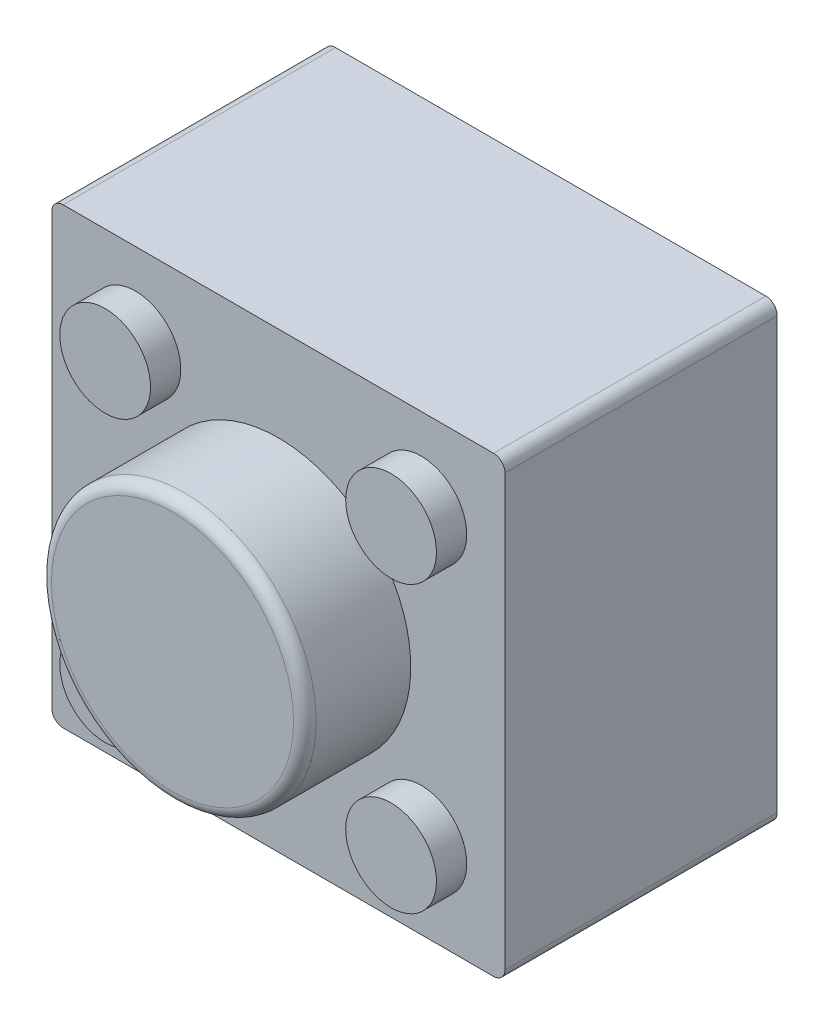
ISO-10303-21;
HEADER;
FILE_DESCRIPTION(('STEP AP214'),'2;1');
FILE_NAME('part.step','',(''),(''),'','','');
FILE_SCHEMA(('AUTOMOTIVE_DESIGN { 1 0 10303 214 1 1 1 1 }'));
ENDSEC;
DATA;
#1=APPLICATION_CONTEXT('core data for automotive mechanical design processes');
#2=APPLICATION_PROTOCOL_DEFINITION('international standard','automotive_design',2000,#1);
#3=PRODUCT_CONTEXT('',#1,'mechanical');
#4=PRODUCT('Part','Part','',(#3));
#5=PRODUCT_RELATED_PRODUCT_CATEGORY('part','',(#4));
#6=PRODUCT_DEFINITION_FORMATION('','',#4);
#7=PRODUCT_DEFINITION_CONTEXT('part definition',#1,'design');
#8=PRODUCT_DEFINITION('design','',#6,#7);
#9=PRODUCT_DEFINITION_SHAPE('','',#8);
#10=(LENGTH_UNIT() NAMED_UNIT(*) SI_UNIT(.MILLI.,.METRE.));
#11=(NAMED_UNIT(*) PLANE_ANGLE_UNIT() SI_UNIT($,.RADIAN.));
#12=(NAMED_UNIT(*) SI_UNIT($,.STERADIAN.) SOLID_ANGLE_UNIT());
#13=UNCERTAINTY_MEASURE_WITH_UNIT(LENGTH_MEASURE(1.E-05),#10,'distance_accuracy_value','');
#14=(GEOMETRIC_REPRESENTATION_CONTEXT(3) GLOBAL_UNCERTAINTY_ASSIGNED_CONTEXT((#13)) GLOBAL_UNIT_ASSIGNED_CONTEXT((#10,
#11,#12)) REPRESENTATION_CONTEXT('',''));
#15=CARTESIAN_POINT('',(0.,0.,0.));
#16=DIRECTION('',(0.,0.,1.));
#17=DIRECTION('',(1.,0.,0.));
#18=AXIS2_PLACEMENT_3D('',#15,#16,#17);
#19=CARTESIAN_POINT('',(0.,0.,3.6));
#20=DIRECTION('',(0.,0.,-1.));
#21=DIRECTION('',(-1.,0.,0.));
#22=AXIS2_PLACEMENT_3D('',#19,#20,#21);
#23=PLANE('',#22);
#24=DIRECTION('',(0.,-1.,0.));
#25=VECTOR('',#24,1.);
#26=CARTESIAN_POINT('',(0.,0.,3.6));
#27=LINE('',#26,#25);
#28=CARTESIAN_POINT('',(0.,5.84,3.6));
#29=VERTEX_POINT('',#28);
#30=CARTESIAN_POINT('',(0.,0.15,3.6));
#31=VERTEX_POINT('',#30);
#32=EDGE_CURVE('E139',#29,#31,#27,.T.);
#33=ORIENTED_EDGE('',*,*,#32,.T.);
#34=CARTESIAN_POINT('',(0.15,0.15,3.6));
#35=DIRECTION('',(0.,0.,-1.));
#36=DIRECTION('',(-1.,0.,0.));
#37=AXIS2_PLACEMENT_3D('',#34,#35,#36);
#38=CIRCLE('',#37,0.15);
#39=CARTESIAN_POINT('',(0.15,0.,3.6));
#40=VERTEX_POINT('',#39);
#41=EDGE_CURVE('E163',#31,#40,#38,.F.);
#42=ORIENTED_EDGE('',*,*,#41,.T.);
#43=DIRECTION('',(1.,0.,0.));
#44=VECTOR('',#43,1.);
#45=CARTESIAN_POINT('',(0.,0.,3.6));
#46=LINE('',#45,#44);
#47=CARTESIAN_POINT('',(5.84,0.,3.6));
#48=VERTEX_POINT('',#47);
#49=EDGE_CURVE('E122',#40,#48,#46,.T.);
#50=ORIENTED_EDGE('',*,*,#49,.T.);
#51=CARTESIAN_POINT('',(5.84,0.15,3.6));
#52=DIRECTION('',(0.,0.,-1.));
#53=DIRECTION('',(-1.,0.,0.));
#54=AXIS2_PLACEMENT_3D('',#51,#52,#53);
#55=CIRCLE('',#54,0.15);
#56=CARTESIAN_POINT('',(5.99,0.15,3.6));
#57=VERTEX_POINT('',#56);
#58=EDGE_CURVE('E158',#48,#57,#55,.F.);
#59=ORIENTED_EDGE('',*,*,#58,.T.);
#60=DIRECTION('',(0.,1.,0.));
#61=VECTOR('',#60,1.);
#62=CARTESIAN_POINT('',(5.99,0.,3.6));
#63=LINE('',#62,#61);
#64=CARTESIAN_POINT('',(5.99,5.84,3.6));
#65=VERTEX_POINT('',#64);
#66=EDGE_CURVE('E271',#57,#65,#63,.T.);
#67=ORIENTED_EDGE('',*,*,#66,.T.);
#68=CARTESIAN_POINT('',(5.84,5.84,3.6));
#69=DIRECTION('',(0.,0.,-1.));
#70=DIRECTION('',(-1.,0.,0.));
#71=AXIS2_PLACEMENT_3D('',#68,#69,#70);
#72=CIRCLE('',#71,0.15);
#73=CARTESIAN_POINT('',(5.84,5.99,3.6));
#74=VERTEX_POINT('',#73);
#75=EDGE_CURVE('E57',#65,#74,#72,.F.);
#76=ORIENTED_EDGE('',*,*,#75,.T.);
#77=DIRECTION('',(-1.,0.,0.));
#78=VECTOR('',#77,1.);
#79=CARTESIAN_POINT('',(0.,5.99,3.6));
#80=LINE('',#79,#78);
#81=CARTESIAN_POINT('',(0.15,5.99,3.6));
#82=VERTEX_POINT('',#81);
#83=EDGE_CURVE('E144',#74,#82,#80,.T.);
#84=ORIENTED_EDGE('',*,*,#83,.T.);
#85=CARTESIAN_POINT('',(0.15,5.84,3.6));
#86=DIRECTION('',(0.,0.,-1.));
#87=DIRECTION('',(-1.,0.,0.));
#88=AXIS2_PLACEMENT_3D('',#85,#86,#87);
#89=CIRCLE('',#88,0.15);
#90=EDGE_CURVE('E161',#82,#29,#89,.F.);
#91=ORIENTED_EDGE('',*,*,#90,.T.);
#92=EDGE_LOOP('',(#33,#42,#50,#59,#67,#76,#84,#91));
#93=FACE_BOUND('',#92,.T.);
#94=CARTESIAN_POINT('',(2.995,2.995,3.6));
#95=DIRECTION('',(0.,0.,-1.));
#96=DIRECTION('',(-1.,0.,0.));
#97=AXIS2_PLACEMENT_3D('',#94,#95,#96);
#98=CIRCLE('',#97,1.75);
#99=CARTESIAN_POINT('',(1.245,2.995,3.6));
#100=VERTEX_POINT('',#99);
#101=EDGE_CURVE('E140',#100,#100,#98,.F.);
#102=ORIENTED_EDGE('',*,*,#101,.F.);
#103=EDGE_LOOP('',(#102));
#104=FACE_BOUND('',#103,.T.);
#105=CARTESIAN_POINT('',(1.105,4.88,3.6));
#106=DIRECTION('',(0.,0.,-1.));
#107=DIRECTION('',(-1.,0.,0.));
#108=AXIS2_PLACEMENT_3D('',#105,#106,#107);
#109=CIRCLE('',#108,0.6);
#110=CARTESIAN_POINT('',(0.504999999999999,4.88,3.6));
#111=VERTEX_POINT('',#110);
#112=EDGE_CURVE('E174',#111,#111,#109,.F.);
#113=ORIENTED_EDGE('',*,*,#112,.F.);
#114=EDGE_LOOP('',(#113));
#115=FACE_BOUND('',#114,.T.);
#116=CARTESIAN_POINT('',(4.885,4.88,3.6));
#117=DIRECTION('',(0.,0.,-1.));
#118=DIRECTION('',(-1.,0.,0.));
#119=AXIS2_PLACEMENT_3D('',#116,#117,#118);
#120=CIRCLE('',#119,0.6);
#121=CARTESIAN_POINT('',(4.285,4.88,3.6));
#122=VERTEX_POINT('',#121);
#123=EDGE_CURVE('E177',#122,#122,#120,.F.);
#124=ORIENTED_EDGE('',*,*,#123,.F.);
#125=EDGE_LOOP('',(#124));
#126=FACE_BOUND('',#125,.T.);
#127=CARTESIAN_POINT('',(4.885,1.11,3.6));
#128=DIRECTION('',(0.,0.,-1.));
#129=DIRECTION('',(-1.,0.,0.));
#130=AXIS2_PLACEMENT_3D('',#127,#128,#129);
#131=CIRCLE('',#130,0.6);
#132=CARTESIAN_POINT('',(4.285,1.11,3.6));
#133=VERTEX_POINT('',#132);
#134=EDGE_CURVE('E43',#133,#133,#131,.F.);
#135=ORIENTED_EDGE('',*,*,#134,.F.);
#136=EDGE_LOOP('',(#135));
#137=FACE_BOUND('',#136,.T.);
#138=CARTESIAN_POINT('',(1.105,1.11,3.6));
#139=DIRECTION('',(0.,0.,-1.));
#140=DIRECTION('',(-1.,0.,0.));
#141=AXIS2_PLACEMENT_3D('',#138,#139,#140);
#142=CIRCLE('',#141,0.6);
#143=CARTESIAN_POINT('',(0.504999999999999,1.11,3.6));
#144=VERTEX_POINT('',#143);
#145=EDGE_CURVE('E11',#144,#144,#142,.F.);
#146=ORIENTED_EDGE('',*,*,#145,.F.);
#147=EDGE_LOOP('',(#146));
#148=FACE_BOUND('',#147,.T.);
#149=ADVANCED_FACE('F35',(#93,#104,#115,#126,#137,#148),#23,.F.);
#150=CARTESIAN_POINT('',(0.,0.,3.6));
#151=DIRECTION('',(1.,0.,0.));
#152=DIRECTION('',(0.,0.,-1.));
#153=AXIS2_PLACEMENT_3D('',#150,#151,#152);
#154=PLANE('',#153);
#155=DIRECTION('',(0.,-1.,0.));
#156=VECTOR('',#155,1.);
#157=CARTESIAN_POINT('',(0.,0.,0.));
#158=LINE('',#157,#156);
#159=CARTESIAN_POINT('',(0.,5.84,0.));
#160=VERTEX_POINT('',#159);
#161=CARTESIAN_POINT('',(0.,0.15,0.));
#162=VERTEX_POINT('',#161);
#163=EDGE_CURVE('E129',#160,#162,#158,.T.);
#164=ORIENTED_EDGE('',*,*,#163,.T.);
#165=DIRECTION('',(0.,0.,-1.));
#166=VECTOR('',#165,1.);
#167=CARTESIAN_POINT('',(0.,0.15,3.6));
#168=LINE('',#167,#166);
#169=EDGE_CURVE('E107',#162,#31,#168,.F.);
#170=ORIENTED_EDGE('',*,*,#169,.T.);
#171=ORIENTED_EDGE('',*,*,#32,.F.);
#172=DIRECTION('',(0.,0.,-1.));
#173=VECTOR('',#172,1.);
#174=CARTESIAN_POINT('',(0.,5.84,3.6));
#175=LINE('',#174,#173);
#176=EDGE_CURVE('E112',#29,#160,#175,.T.);
#177=ORIENTED_EDGE('',*,*,#176,.T.);
#178=EDGE_LOOP('',(#164,#170,#171,#177));
#179=FACE_BOUND('',#178,.T.);
#180=ADVANCED_FACE('F186',(#179),#154,.F.);
#181=CARTESIAN_POINT('',(0.,0.,3.6));
#182=DIRECTION('',(0.,1.,0.));
#183=DIRECTION('',(0.,0.,1.));
#184=AXIS2_PLACEMENT_3D('',#181,#182,#183);
#185=PLANE('',#184);
#186=ORIENTED_EDGE('',*,*,#49,.F.);
#187=DIRECTION('',(0.,0.,-1.));
#188=VECTOR('',#187,1.);
#189=CARTESIAN_POINT('',(0.15,0.,3.6));
#190=LINE('',#189,#188);
#191=CARTESIAN_POINT('',(0.15,0.,0.));
#192=VERTEX_POINT('',#191);
#193=EDGE_CURVE('E106',#40,#192,#190,.T.);
#194=ORIENTED_EDGE('',*,*,#193,.T.);
#195=DIRECTION('',(1.,0.,0.));
#196=VECTOR('',#195,1.);
#197=CARTESIAN_POINT('',(0.,0.,0.));
#198=LINE('',#197,#196);
#199=CARTESIAN_POINT('',(5.84,0.,0.));
#200=VERTEX_POINT('',#199);
#201=EDGE_CURVE('E119',#192,#200,#198,.T.);
#202=ORIENTED_EDGE('',*,*,#201,.T.);
#203=DIRECTION('',(0.,0.,-1.));
#204=VECTOR('',#203,1.);
#205=CARTESIAN_POINT('',(5.84,0.,3.6));
#206=LINE('',#205,#204);
#207=EDGE_CURVE('E124',#200,#48,#206,.F.);
#208=ORIENTED_EDGE('',*,*,#207,.T.);
#209=EDGE_LOOP('',(#186,#194,#202,#208));
#210=FACE_BOUND('',#209,.T.);
#211=ADVANCED_FACE('F118',(#210),#185,.F.);
#212=CARTESIAN_POINT('',(5.99,0.,3.6));
#213=DIRECTION('',(-1.,0.,0.));
#214=DIRECTION('',(0.,0.,1.));
#215=AXIS2_PLACEMENT_3D('',#212,#213,#214);
#216=PLANE('',#215);
#217=DIRECTION('',(0.,1.,0.));
#218=VECTOR('',#217,1.);
#219=CARTESIAN_POINT('',(5.99,0.,0.));
#220=LINE('',#219,#218);
#221=CARTESIAN_POINT('',(5.99,0.15,0.));
#222=VERTEX_POINT('',#221);
#223=CARTESIAN_POINT('',(5.99,5.84,0.));
#224=VERTEX_POINT('',#223);
#225=EDGE_CURVE('E128',#222,#224,#220,.T.);
#226=ORIENTED_EDGE('',*,*,#225,.T.);
#227=DIRECTION('',(0.,0.,-1.));
#228=VECTOR('',#227,1.);
#229=CARTESIAN_POINT('',(5.99,5.84,3.6));
#230=LINE('',#229,#228);
#231=EDGE_CURVE('E172',#224,#65,#230,.F.);
#232=ORIENTED_EDGE('',*,*,#231,.T.);
#233=ORIENTED_EDGE('',*,*,#66,.F.);
#234=DIRECTION('',(0.,0.,-1.));
#235=VECTOR('',#234,1.);
#236=CARTESIAN_POINT('',(5.99,0.15,3.6));
#237=LINE('',#236,#235);
#238=EDGE_CURVE('E169',#57,#222,#237,.T.);
#239=ORIENTED_EDGE('',*,*,#238,.T.);
#240=EDGE_LOOP('',(#226,#232,#233,#239));
#241=FACE_BOUND('',#240,.T.);
#242=ADVANCED_FACE('F239',(#241),#216,.F.);
#243=CARTESIAN_POINT('',(0.,5.99,3.6));
#244=DIRECTION('',(0.,-1.,0.));
#245=DIRECTION('',(0.,0.,-1.));
#246=AXIS2_PLACEMENT_3D('',#243,#244,#245);
#247=PLANE('',#246);
#248=DIRECTION('',(-1.,0.,0.));
#249=VECTOR('',#248,1.);
#250=CARTESIAN_POINT('',(0.,5.99,0.));
#251=LINE('',#250,#249);
#252=CARTESIAN_POINT('',(5.84,5.99,0.));
#253=VERTEX_POINT('',#252);
#254=CARTESIAN_POINT('',(0.15,5.99,0.));
#255=VERTEX_POINT('',#254);
#256=EDGE_CURVE('E132',#253,#255,#251,.T.);
#257=ORIENTED_EDGE('',*,*,#256,.T.);
#258=DIRECTION('',(0.,0.,-1.));
#259=VECTOR('',#258,1.);
#260=CARTESIAN_POINT('',(0.15,5.99,3.6));
#261=LINE('',#260,#259);
#262=EDGE_CURVE('E50',#255,#82,#261,.F.);
#263=ORIENTED_EDGE('',*,*,#262,.T.);
#264=ORIENTED_EDGE('',*,*,#83,.F.);
#265=DIRECTION('',(0.,0.,-1.));
#266=VECTOR('',#265,1.);
#267=CARTESIAN_POINT('',(5.84,5.99,3.6));
#268=LINE('',#267,#266);
#269=EDGE_CURVE('E165',#74,#253,#268,.T.);
#270=ORIENTED_EDGE('',*,*,#269,.T.);
#271=EDGE_LOOP('',(#257,#263,#264,#270));
#272=FACE_BOUND('',#271,.T.);
#273=ADVANCED_FACE('F236',(#272),#247,.F.);
#274=CARTESIAN_POINT('',(0.,0.,0.));
#275=DIRECTION('',(0.,0.,-1.));
#276=DIRECTION('',(-1.,0.,0.));
#277=AXIS2_PLACEMENT_3D('',#274,#275,#276);
#278=PLANE('',#277);
#279=ORIENTED_EDGE('',*,*,#201,.F.);
#280=CARTESIAN_POINT('',(0.15,0.15,0.));
#281=DIRECTION('',(0.,0.,-1.));
#282=DIRECTION('',(-1.,0.,0.));
#283=AXIS2_PLACEMENT_3D('',#280,#281,#282);
#284=CIRCLE('',#283,0.15);
#285=EDGE_CURVE('E102',#192,#162,#284,.T.);
#286=ORIENTED_EDGE('',*,*,#285,.T.);
#287=ORIENTED_EDGE('',*,*,#163,.F.);
#288=CARTESIAN_POINT('',(0.15,5.84,0.));
#289=DIRECTION('',(0.,0.,-1.));
#290=DIRECTION('',(-1.,0.,0.));
#291=AXIS2_PLACEMENT_3D('',#288,#289,#290);
#292=CIRCLE('',#291,0.15);
#293=EDGE_CURVE('E113',#160,#255,#292,.T.);
#294=ORIENTED_EDGE('',*,*,#293,.T.);
#295=ORIENTED_EDGE('',*,*,#256,.F.);
#296=CARTESIAN_POINT('',(5.84,5.84,0.));
#297=DIRECTION('',(0.,0.,-1.));
#298=DIRECTION('',(-1.,0.,0.));
#299=AXIS2_PLACEMENT_3D('',#296,#297,#298);
#300=CIRCLE('',#299,0.15);
#301=EDGE_CURVE('E152',#253,#224,#300,.T.);
#302=ORIENTED_EDGE('',*,*,#301,.T.);
#303=ORIENTED_EDGE('',*,*,#225,.F.);
#304=CARTESIAN_POINT('',(5.84,0.15,0.));
#305=DIRECTION('',(0.,0.,-1.));
#306=DIRECTION('',(-1.,0.,0.));
#307=AXIS2_PLACEMENT_3D('',#304,#305,#306);
#308=CIRCLE('',#307,0.15);
#309=EDGE_CURVE('E123',#222,#200,#308,.T.);
#310=ORIENTED_EDGE('',*,*,#309,.T.);
#311=EDGE_LOOP('',(#279,#286,#287,#294,#295,#302,#303,#310));
#312=FACE_BOUND('',#311,.T.);
#313=ADVANCED_FACE('F126',(#312),#278,.T.);
#314=CARTESIAN_POINT('',(2.995,2.995,5.));
#315=DIRECTION('',(0.,0.,-1.));
#316=DIRECTION('',(-1.,0.,0.));
#317=AXIS2_PLACEMENT_3D('',#314,#315,#316);
#318=CYLINDRICAL_SURFACE('',#317,1.75);
#319=CARTESIAN_POINT('',(2.995,2.995,4.85));
#320=DIRECTION('',(0.,0.,1.));
#321=DIRECTION('',(1.,0.,0.));
#322=AXIS2_PLACEMENT_3D('',#319,#320,#321);
#323=CIRCLE('',#322,1.75);
#324=CARTESIAN_POINT('',(4.745,2.995,4.85));
#325=VERTEX_POINT('',#324);
#326=EDGE_CURVE('E147',#325,#325,#323,.F.);
#327=ORIENTED_EDGE('',*,*,#326,.T.);
#328=EDGE_LOOP('',(#327));
#329=FACE_BOUND('',#328,.T.);
#330=ORIENTED_EDGE('',*,*,#101,.T.);
#331=EDGE_LOOP('',(#330));
#332=FACE_BOUND('',#331,.T.);
#333=ADVANCED_FACE('F229',(#329,#332),#318,.T.);
#334=CARTESIAN_POINT('',(2.995,2.995,5.));
#335=DIRECTION('',(0.,0.,1.));
#336=DIRECTION('',(1.,0.,0.));
#337=AXIS2_PLACEMENT_3D('',#334,#335,#336);
#338=PLANE('',#337);
#339=CARTESIAN_POINT('',(2.995,2.995,5.));
#340=DIRECTION('',(0.,0.,1.));
#341=DIRECTION('',(1.,0.,0.));
#342=AXIS2_PLACEMENT_3D('',#339,#340,#341);
#343=CIRCLE('',#342,1.6);
#344=CARTESIAN_POINT('',(4.595,2.995,5.));
#345=VERTEX_POINT('',#344);
#346=EDGE_CURVE('E143',#345,#345,#343,.T.);
#347=ORIENTED_EDGE('',*,*,#346,.T.);
#348=EDGE_LOOP('',(#347));
#349=FACE_BOUND('',#348,.T.);
#350=ADVANCED_FACE('F225',(#349),#338,.T.);
#351=CARTESIAN_POINT('',(2.995,2.995,4.85));
#352=DIRECTION('',(0.,0.,1.));
#353=DIRECTION('',(1.,0.,0.));
#354=AXIS2_PLACEMENT_3D('',#351,#352,#353);
#355=TOROIDAL_SURFACE('',#354,1.6,0.15);
#356=ORIENTED_EDGE('',*,*,#326,.F.);
#357=EDGE_LOOP('',(#356));
#358=FACE_BOUND('',#357,.T.);
#359=ORIENTED_EDGE('',*,*,#346,.F.);
#360=EDGE_LOOP('',(#359));
#361=FACE_BOUND('',#360,.T.);
#362=ADVANCED_FACE('F228',(#358,#361),#355,.T.);
#363=CARTESIAN_POINT('',(0.15,0.15,3.6));
#364=DIRECTION('',(0.,0.,-1.));
#365=DIRECTION('',(-1.,0.,0.));
#366=AXIS2_PLACEMENT_3D('',#363,#364,#365);
#367=CYLINDRICAL_SURFACE('',#366,0.15);
#368=ORIENTED_EDGE('',*,*,#41,.F.);
#369=ORIENTED_EDGE('',*,*,#169,.F.);
#370=ORIENTED_EDGE('',*,*,#285,.F.);
#371=ORIENTED_EDGE('',*,*,#193,.F.);
#372=EDGE_LOOP('',(#368,#369,#370,#371));
#373=FACE_BOUND('',#372,.T.);
#374=ADVANCED_FACE('F105',(#373),#367,.T.);
#375=CARTESIAN_POINT('',(0.15,5.84,3.6));
#376=DIRECTION('',(0.,0.,-1.));
#377=DIRECTION('',(-1.,0.,0.));
#378=AXIS2_PLACEMENT_3D('',#375,#376,#377);
#379=CYLINDRICAL_SURFACE('',#378,0.15);
#380=ORIENTED_EDGE('',*,*,#90,.F.);
#381=ORIENTED_EDGE('',*,*,#262,.F.);
#382=ORIENTED_EDGE('',*,*,#293,.F.);
#383=ORIENTED_EDGE('',*,*,#176,.F.);
#384=EDGE_LOOP('',(#380,#381,#382,#383));
#385=FACE_BOUND('',#384,.T.);
#386=ADVANCED_FACE('F253',(#385),#379,.T.);
#387=CARTESIAN_POINT('',(5.84,5.84,3.6));
#388=DIRECTION('',(0.,0.,-1.));
#389=DIRECTION('',(-1.,0.,0.));
#390=AXIS2_PLACEMENT_3D('',#387,#388,#389);
#391=CYLINDRICAL_SURFACE('',#390,0.15);
#392=ORIENTED_EDGE('',*,*,#75,.F.);
#393=ORIENTED_EDGE('',*,*,#231,.F.);
#394=ORIENTED_EDGE('',*,*,#301,.F.);
#395=ORIENTED_EDGE('',*,*,#269,.F.);
#396=EDGE_LOOP('',(#392,#393,#394,#395));
#397=FACE_BOUND('',#396,.T.);
#398=ADVANCED_FACE('F255',(#397),#391,.T.);
#399=CARTESIAN_POINT('',(5.84,0.15,3.6));
#400=DIRECTION('',(0.,0.,-1.));
#401=DIRECTION('',(-1.,0.,0.));
#402=AXIS2_PLACEMENT_3D('',#399,#400,#401);
#403=CYLINDRICAL_SURFACE('',#402,0.15);
#404=ORIENTED_EDGE('',*,*,#58,.F.);
#405=ORIENTED_EDGE('',*,*,#207,.F.);
#406=ORIENTED_EDGE('',*,*,#309,.F.);
#407=ORIENTED_EDGE('',*,*,#238,.F.);
#408=EDGE_LOOP('',(#404,#405,#406,#407));
#409=FACE_BOUND('',#408,.T.);
#410=ADVANCED_FACE('F37',(#409),#403,.T.);
#411=CARTESIAN_POINT('',(1.105,4.88,4.));
#412=DIRECTION('',(0.,0.,-1.));
#413=DIRECTION('',(-1.,0.,0.));
#414=AXIS2_PLACEMENT_3D('',#411,#412,#413);
#415=CYLINDRICAL_SURFACE('',#414,0.6);
#416=CARTESIAN_POINT('',(1.105,4.88,4.));
#417=DIRECTION('',(0.,0.,1.));
#418=DIRECTION('',(1.,0.,0.));
#419=AXIS2_PLACEMENT_3D('',#416,#417,#418);
#420=CIRCLE('',#419,0.6);
#421=CARTESIAN_POINT('',(1.705,4.88,4.));
#422=VERTEX_POINT('',#421);
#423=EDGE_CURVE('E134',#422,#422,#420,.T.);
#424=ORIENTED_EDGE('',*,*,#423,.F.);
#425=EDGE_LOOP('',(#424));
#426=FACE_BOUND('',#425,.T.);
#427=ORIENTED_EDGE('',*,*,#112,.T.);
#428=EDGE_LOOP('',(#427));
#429=FACE_BOUND('',#428,.T.);
#430=ADVANCED_FACE('F220',(#426,#429),#415,.T.);
#431=CARTESIAN_POINT('',(1.105,4.88,4.));
#432=DIRECTION('',(0.,0.,1.));
#433=DIRECTION('',(1.,0.,0.));
#434=AXIS2_PLACEMENT_3D('',#431,#432,#433);
#435=PLANE('',#434);
#436=ORIENTED_EDGE('',*,*,#423,.T.);
#437=EDGE_LOOP('',(#436));
#438=FACE_BOUND('',#437,.T.);
#439=ADVANCED_FACE('F216',(#438),#435,.T.);
#440=CARTESIAN_POINT('',(4.885,4.88,4.));
#441=DIRECTION('',(0.,0.,-1.));
#442=DIRECTION('',(-1.,0.,0.));
#443=AXIS2_PLACEMENT_3D('',#440,#441,#442);
#444=CYLINDRICAL_SURFACE('',#443,0.6);
#445=CARTESIAN_POINT('',(4.885,4.88,4.));
#446=DIRECTION('',(0.,0.,1.));
#447=DIRECTION('',(1.,0.,0.));
#448=AXIS2_PLACEMENT_3D('',#445,#446,#447);
#449=CIRCLE('',#448,0.6);
#450=CARTESIAN_POINT('',(5.485,4.88,4.));
#451=VERTEX_POINT('',#450);
#452=EDGE_CURVE('E289',#451,#451,#449,.T.);
#453=ORIENTED_EDGE('',*,*,#452,.F.);
#454=EDGE_LOOP('',(#453));
#455=FACE_BOUND('',#454,.T.);
#456=ORIENTED_EDGE('',*,*,#123,.T.);
#457=EDGE_LOOP('',(#456));
#458=FACE_BOUND('',#457,.T.);
#459=ADVANCED_FACE('F212',(#455,#458),#444,.T.);
#460=CARTESIAN_POINT('',(4.885,4.88,4.));
#461=DIRECTION('',(0.,0.,1.));
#462=DIRECTION('',(1.,0.,0.));
#463=AXIS2_PLACEMENT_3D('',#460,#461,#462);
#464=PLANE('',#463);
#465=ORIENTED_EDGE('',*,*,#452,.T.);
#466=EDGE_LOOP('',(#465));
#467=FACE_BOUND('',#466,.T.);
#468=ADVANCED_FACE('F208',(#467),#464,.T.);
#469=CARTESIAN_POINT('',(4.885,1.11,4.));
#470=DIRECTION('',(0.,0.,-1.));
#471=DIRECTION('',(-1.,0.,0.));
#472=AXIS2_PLACEMENT_3D('',#469,#470,#471);
#473=CYLINDRICAL_SURFACE('',#472,0.6);
#474=CARTESIAN_POINT('',(4.885,1.11,4.));
#475=DIRECTION('',(0.,0.,1.));
#476=DIRECTION('',(1.,0.,0.));
#477=AXIS2_PLACEMENT_3D('',#474,#475,#476);
#478=CIRCLE('',#477,0.6);
#479=CARTESIAN_POINT('',(5.485,1.11,4.));
#480=VERTEX_POINT('',#479);
#481=EDGE_CURVE('E292',#480,#480,#478,.T.);
#482=ORIENTED_EDGE('',*,*,#481,.F.);
#483=EDGE_LOOP('',(#482));
#484=FACE_BOUND('',#483,.T.);
#485=ORIENTED_EDGE('',*,*,#134,.T.);
#486=EDGE_LOOP('',(#485));
#487=FACE_BOUND('',#486,.T.);
#488=ADVANCED_FACE('F182',(#484,#487),#473,.T.);
#489=CARTESIAN_POINT('',(4.885,1.11,4.));
#490=DIRECTION('',(0.,0.,1.));
#491=DIRECTION('',(1.,0.,0.));
#492=AXIS2_PLACEMENT_3D('',#489,#490,#491);
#493=PLANE('',#492);
#494=ORIENTED_EDGE('',*,*,#481,.T.);
#495=EDGE_LOOP('',(#494));
#496=FACE_BOUND('',#495,.T.);
#497=ADVANCED_FACE('F193',(#496),#493,.T.);
#498=CARTESIAN_POINT('',(1.105,1.11,4.));
#499=DIRECTION('',(0.,0.,-1.));
#500=DIRECTION('',(-1.,0.,0.));
#501=AXIS2_PLACEMENT_3D('',#498,#499,#500);
#502=CYLINDRICAL_SURFACE('',#501,0.6);
#503=CARTESIAN_POINT('',(1.105,1.11,4.));
#504=DIRECTION('',(0.,0.,1.));
#505=DIRECTION('',(1.,0.,0.));
#506=AXIS2_PLACEMENT_3D('',#503,#504,#505);
#507=CIRCLE('',#506,0.6);
#508=CARTESIAN_POINT('',(1.705,1.11,4.));
#509=VERTEX_POINT('',#508);
#510=EDGE_CURVE('E295',#509,#509,#507,.T.);
#511=ORIENTED_EDGE('',*,*,#510,.F.);
#512=EDGE_LOOP('',(#511));
#513=FACE_BOUND('',#512,.T.);
#514=ORIENTED_EDGE('',*,*,#145,.T.);
#515=EDGE_LOOP('',(#514));
#516=FACE_BOUND('',#515,.T.);
#517=ADVANCED_FACE('F190',(#513,#516),#502,.T.);
#518=CARTESIAN_POINT('',(1.105,1.11,4.));
#519=DIRECTION('',(0.,0.,1.));
#520=DIRECTION('',(1.,0.,0.));
#521=AXIS2_PLACEMENT_3D('',#518,#519,#520);
#522=PLANE('',#521);
#523=ORIENTED_EDGE('',*,*,#510,.T.);
#524=EDGE_LOOP('',(#523));
#525=FACE_BOUND('',#524,.T.);
#526=ADVANCED_FACE('F192',(#525),#522,.T.);
#527=CLOSED_SHELL('',(#149,#180,#211,#242,#273,#313,#333,#350,#362,#374,#386,#398,#410,#430,
#439,#459,#468,#488,#497,#517,#526));
#528=MANIFOLD_SOLID_BREP('B2',#527);
#529=ADVANCED_BREP_SHAPE_REPRESENTATION('',(#18,#528),#14);
#530=SHAPE_DEFINITION_REPRESENTATION(#9,#529);
ENDSEC;
END-ISO-10303-21;
